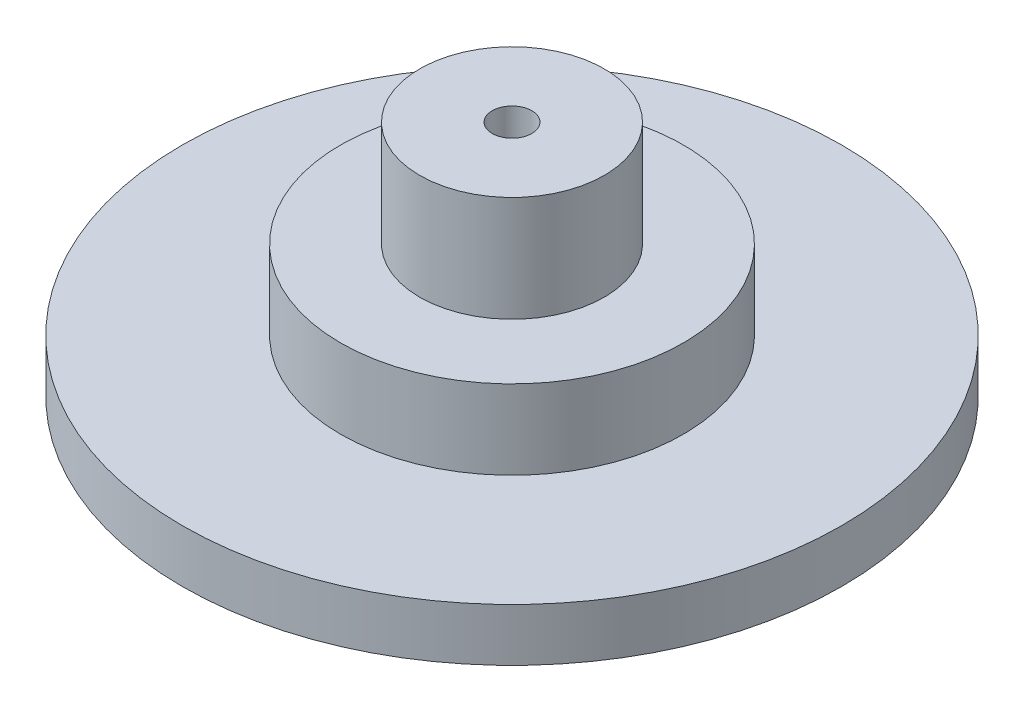
ISO-10303-21;
HEADER;
FILE_DESCRIPTION(('STEP AP214'),'2;1');
FILE_NAME('part.step','',(''),(''),'','','');
FILE_SCHEMA(('AUTOMOTIVE_DESIGN { 1 0 10303 214 1 1 1 1 }'));
ENDSEC;
DATA;
#1=APPLICATION_CONTEXT('core data for automotive mechanical design processes');
#2=APPLICATION_PROTOCOL_DEFINITION('international standard','automotive_design',2000,#1);
#3=PRODUCT_CONTEXT('',#1,'mechanical');
#4=PRODUCT('Part','Part','',(#3));
#5=PRODUCT_RELATED_PRODUCT_CATEGORY('part','',(#4));
#6=PRODUCT_DEFINITION_FORMATION('','',#4);
#7=PRODUCT_DEFINITION_CONTEXT('part definition',#1,'design');
#8=PRODUCT_DEFINITION('design','',#6,#7);
#9=PRODUCT_DEFINITION_SHAPE('','',#8);
#10=(LENGTH_UNIT() NAMED_UNIT(*) SI_UNIT(.MILLI.,.METRE.));
#11=(NAMED_UNIT(*) PLANE_ANGLE_UNIT() SI_UNIT($,.RADIAN.));
#12=(NAMED_UNIT(*) SI_UNIT($,.STERADIAN.) SOLID_ANGLE_UNIT());
#13=UNCERTAINTY_MEASURE_WITH_UNIT(LENGTH_MEASURE(1.E-05),#10,'distance_accuracy_value','');
#14=(GEOMETRIC_REPRESENTATION_CONTEXT(3) GLOBAL_UNCERTAINTY_ASSIGNED_CONTEXT((#13)) GLOBAL_UNIT_ASSIGNED_CONTEXT((#10,
#11,#12)) REPRESENTATION_CONTEXT('',''));
#15=CARTESIAN_POINT('',(0.,0.,0.));
#16=DIRECTION('',(0.,0.,1.));
#17=DIRECTION('',(1.,0.,0.));
#18=AXIS2_PLACEMENT_3D('',#15,#16,#17);
#19=CARTESIAN_POINT('',(0.,4.,0.));
#20=DIRECTION('',(0.,-1.,0.));
#21=DIRECTION('',(0.,0.,-1.));
#22=AXIS2_PLACEMENT_3D('',#19,#20,#21);
#23=CYLINDRICAL_SURFACE('',#22,25.);
#24=CARTESIAN_POINT('',(0.,4.,0.));
#25=DIRECTION('',(0.,1.,0.));
#26=DIRECTION('',(0.,0.,1.));
#27=AXIS2_PLACEMENT_3D('',#24,#25,#26);
#28=CIRCLE('',#27,25.);
#29=CARTESIAN_POINT('',(0.,4.,25.));
#30=VERTEX_POINT('',#29);
#31=EDGE_CURVE('E43',#30,#30,#28,.T.);
#32=ORIENTED_EDGE('',*,*,#31,.F.);
#33=EDGE_LOOP('',(#32));
#34=FACE_BOUND('',#33,.T.);
#35=CARTESIAN_POINT('',(0.,0.,0.));
#36=DIRECTION('',(0.,1.,0.));
#37=DIRECTION('',(0.,0.,1.));
#38=AXIS2_PLACEMENT_3D('',#35,#36,#37);
#39=CIRCLE('',#38,25.);
#40=CARTESIAN_POINT('',(0.,0.,25.));
#41=VERTEX_POINT('',#40);
#42=EDGE_CURVE('E34',#41,#41,#39,.T.);
#43=ORIENTED_EDGE('',*,*,#42,.T.);
#44=EDGE_LOOP('',(#43));
#45=FACE_BOUND('',#44,.T.);
#46=ADVANCED_FACE('F31',(#34,#45),#23,.T.);
#47=CARTESIAN_POINT('',(0.,4.,0.));
#48=DIRECTION('',(0.,1.,0.));
#49=DIRECTION('',(0.,0.,1.));
#50=AXIS2_PLACEMENT_3D('',#47,#48,#49);
#51=PLANE('',#50);
#52=CARTESIAN_POINT('',(0.,4.,0.));
#53=DIRECTION('',(0.,1.,0.));
#54=DIRECTION('',(0.,0.,1.));
#55=AXIS2_PLACEMENT_3D('',#52,#53,#54);
#56=CIRCLE('',#55,13.);
#57=CARTESIAN_POINT('',(0.,4.,13.));
#58=VERTEX_POINT('',#57);
#59=EDGE_CURVE('E38',#58,#58,#56,.T.);
#60=ORIENTED_EDGE('',*,*,#59,.F.);
#61=EDGE_LOOP('',(#60));
#62=FACE_BOUND('',#61,.T.);
#63=ORIENTED_EDGE('',*,*,#31,.T.);
#64=EDGE_LOOP('',(#63));
#65=FACE_BOUND('',#64,.T.);
#66=ADVANCED_FACE('F61',(#62,#65),#51,.T.);
#67=CARTESIAN_POINT('',(0.,0.,0.));
#68=DIRECTION('',(0.,1.,0.));
#69=DIRECTION('',(0.,0.,1.));
#70=AXIS2_PLACEMENT_3D('',#67,#68,#69);
#71=PLANE('',#70);
#72=CARTESIAN_POINT('',(0.,0.,0.));
#73=DIRECTION('',(0.,1.,0.));
#74=DIRECTION('',(0.,0.,1.));
#75=AXIS2_PLACEMENT_3D('',#72,#73,#74);
#76=CIRCLE('',#75,1.5);
#77=CARTESIAN_POINT('',(0.,0.,1.5));
#78=VERTEX_POINT('',#77);
#79=EDGE_CURVE('E136',#78,#78,#76,.T.);
#80=ORIENTED_EDGE('',*,*,#79,.T.);
#81=EDGE_LOOP('',(#80));
#82=FACE_BOUND('',#81,.T.);
#83=ORIENTED_EDGE('',*,*,#42,.F.);
#84=EDGE_LOOP('',(#83));
#85=FACE_BOUND('',#84,.T.);
#86=ADVANCED_FACE('F58',(#82,#85),#71,.F.);
#87=CARTESIAN_POINT('',(0.,10.,0.));
#88=DIRECTION('',(0.,-1.,0.));
#89=DIRECTION('',(0.,0.,-1.));
#90=AXIS2_PLACEMENT_3D('',#87,#88,#89);
#91=CYLINDRICAL_SURFACE('',#90,13.);
#92=CARTESIAN_POINT('',(0.,10.,0.));
#93=DIRECTION('',(0.,1.,0.));
#94=DIRECTION('',(0.,0.,1.));
#95=AXIS2_PLACEMENT_3D('',#92,#93,#94);
#96=CIRCLE('',#95,13.);
#97=CARTESIAN_POINT('',(0.,10.,13.));
#98=VERTEX_POINT('',#97);
#99=EDGE_CURVE('E49',#98,#98,#96,.T.);
#100=ORIENTED_EDGE('',*,*,#99,.F.);
#101=EDGE_LOOP('',(#100));
#102=FACE_BOUND('',#101,.T.);
#103=ORIENTED_EDGE('',*,*,#59,.T.);
#104=EDGE_LOOP('',(#103));
#105=FACE_BOUND('',#104,.T.);
#106=ADVANCED_FACE('F60',(#102,#105),#91,.T.);
#107=CARTESIAN_POINT('',(0.,10.,0.));
#108=DIRECTION('',(0.,1.,0.));
#109=DIRECTION('',(0.,0.,1.));
#110=AXIS2_PLACEMENT_3D('',#107,#108,#109);
#111=PLANE('',#110);
#112=CARTESIAN_POINT('',(0.,10.,0.));
#113=DIRECTION('',(0.,1.,0.));
#114=DIRECTION('',(0.,0.,1.));
#115=AXIS2_PLACEMENT_3D('',#112,#113,#114);
#116=CIRCLE('',#115,7.);
#117=CARTESIAN_POINT('',(0.,10.,7.));
#118=VERTEX_POINT('',#117);
#119=EDGE_CURVE('E10',#118,#118,#116,.T.);
#120=ORIENTED_EDGE('',*,*,#119,.F.);
#121=EDGE_LOOP('',(#120));
#122=FACE_BOUND('',#121,.T.);
#123=ORIENTED_EDGE('',*,*,#99,.T.);
#124=EDGE_LOOP('',(#123));
#125=FACE_BOUND('',#124,.T.);
#126=ADVANCED_FACE('F67',(#122,#125),#111,.T.);
#127=CARTESIAN_POINT('',(0.,18.,0.));
#128=DIRECTION('',(0.,-1.,0.));
#129=DIRECTION('',(0.,0.,-1.));
#130=AXIS2_PLACEMENT_3D('',#127,#128,#129);
#131=CYLINDRICAL_SURFACE('',#130,7.);
#132=CARTESIAN_POINT('',(0.,18.,0.));
#133=DIRECTION('',(0.,1.,0.));
#134=DIRECTION('',(0.,0.,1.));
#135=AXIS2_PLACEMENT_3D('',#132,#133,#134);
#136=CIRCLE('',#135,7.);
#137=CARTESIAN_POINT('',(0.,18.,7.));
#138=VERTEX_POINT('',#137);
#139=EDGE_CURVE('E47',#138,#138,#136,.T.);
#140=ORIENTED_EDGE('',*,*,#139,.F.);
#141=EDGE_LOOP('',(#140));
#142=FACE_BOUND('',#141,.T.);
#143=ORIENTED_EDGE('',*,*,#119,.T.);
#144=EDGE_LOOP('',(#143));
#145=FACE_BOUND('',#144,.T.);
#146=ADVANCED_FACE('F97',(#142,#145),#131,.T.);
#147=CARTESIAN_POINT('',(0.,18.,0.));
#148=DIRECTION('',(0.,1.,0.));
#149=DIRECTION('',(0.,0.,1.));
#150=AXIS2_PLACEMENT_3D('',#147,#148,#149);
#151=PLANE('',#150);
#152=CARTESIAN_POINT('',(0.,18.,0.));
#153=DIRECTION('',(0.,1.,0.));
#154=DIRECTION('',(0.,0.,1.));
#155=AXIS2_PLACEMENT_3D('',#152,#153,#154);
#156=CIRCLE('',#155,1.5);
#157=CARTESIAN_POINT('',(0.,18.,1.5));
#158=VERTEX_POINT('',#157);
#159=EDGE_CURVE('E139',#158,#158,#156,.T.);
#160=ORIENTED_EDGE('',*,*,#159,.F.);
#161=EDGE_LOOP('',(#160));
#162=FACE_BOUND('',#161,.T.);
#163=ORIENTED_EDGE('',*,*,#139,.T.);
#164=EDGE_LOOP('',(#163));
#165=FACE_BOUND('',#164,.T.);
#166=ADVANCED_FACE('F106',(#162,#165),#151,.T.);
#167=CARTESIAN_POINT('',(0.,0.,0.));
#168=DIRECTION('',(0.,1.,0.));
#169=DIRECTION('',(0.,0.,1.));
#170=AXIS2_PLACEMENT_3D('',#167,#168,#169);
#171=CYLINDRICAL_SURFACE('',#170,1.5);
#172=ORIENTED_EDGE('',*,*,#79,.F.);
#173=EDGE_LOOP('',(#172));
#174=FACE_BOUND('',#173,.T.);
#175=ORIENTED_EDGE('',*,*,#159,.T.);
#176=EDGE_LOOP('',(#175));
#177=FACE_BOUND('',#176,.T.);
#178=ADVANCED_FACE('F120',(#174,#177),#171,.F.);
#179=CLOSED_SHELL('',(#46,#66,#86,#106,#126,#146,#166,#178));
#180=MANIFOLD_SOLID_BREP('B2',#179);
#181=ADVANCED_BREP_SHAPE_REPRESENTATION('',(#18,#180),#14);
#182=SHAPE_DEFINITION_REPRESENTATION(#9,#181);
ENDSEC;
END-ISO-10303-21;
